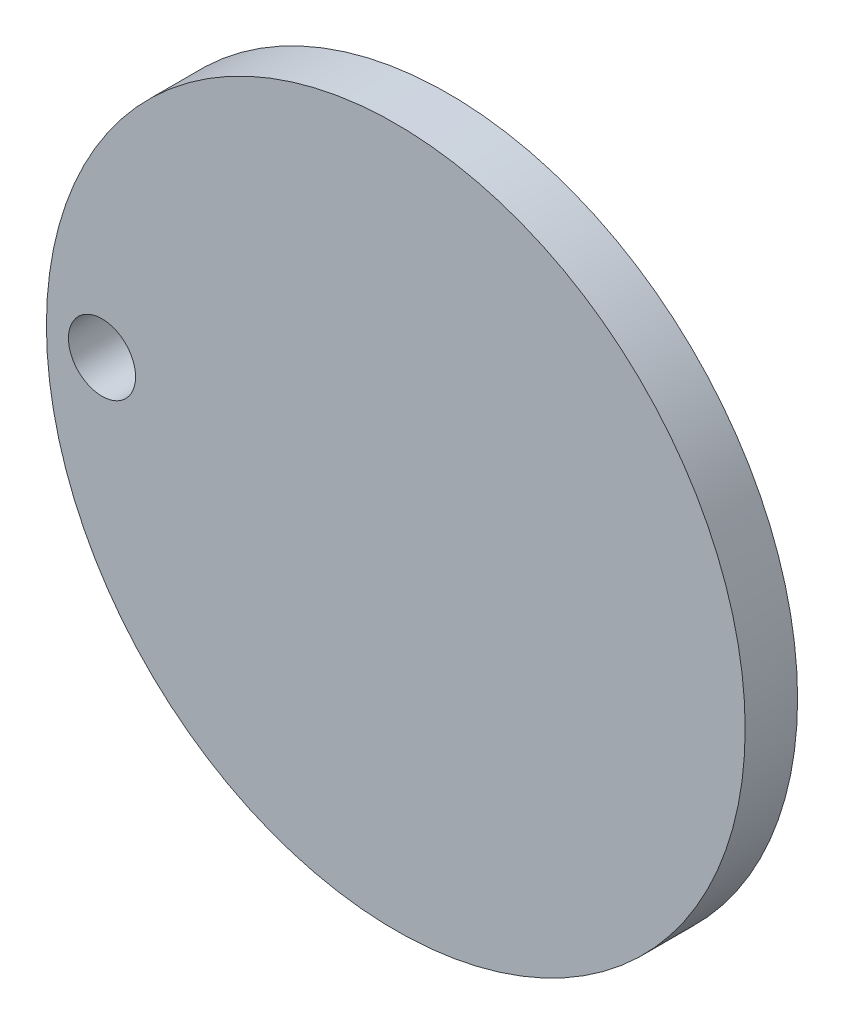
ISO-10303-21;
HEADER;
FILE_DESCRIPTION(('STEP AP214'),'2;1');
FILE_NAME('part.step','',(''),(''),'','','');
FILE_SCHEMA(('AUTOMOTIVE_DESIGN { 1 0 10303 214 1 1 1 1 }'));
ENDSEC;
DATA;
#1=APPLICATION_CONTEXT('core data for automotive mechanical design processes');
#2=APPLICATION_PROTOCOL_DEFINITION('international standard','automotive_design',2000,#1);
#3=PRODUCT_CONTEXT('',#1,'mechanical');
#4=PRODUCT('Part','Part','',(#3));
#5=PRODUCT_RELATED_PRODUCT_CATEGORY('part','',(#4));
#6=PRODUCT_DEFINITION_FORMATION('','',#4);
#7=PRODUCT_DEFINITION_CONTEXT('part definition',#1,'design');
#8=PRODUCT_DEFINITION('design','',#6,#7);
#9=PRODUCT_DEFINITION_SHAPE('','',#8);
#10=(LENGTH_UNIT() NAMED_UNIT(*) SI_UNIT(.MILLI.,.METRE.));
#11=(NAMED_UNIT(*) PLANE_ANGLE_UNIT() SI_UNIT($,.RADIAN.));
#12=(NAMED_UNIT(*) SI_UNIT($,.STERADIAN.) SOLID_ANGLE_UNIT());
#13=UNCERTAINTY_MEASURE_WITH_UNIT(LENGTH_MEASURE(1.E-05),#10,'distance_accuracy_value','');
#14=(GEOMETRIC_REPRESENTATION_CONTEXT(3) GLOBAL_UNCERTAINTY_ASSIGNED_CONTEXT((#13)) GLOBAL_UNIT_ASSIGNED_CONTEXT((#10,
#11,#12)) REPRESENTATION_CONTEXT('',''));
#15=CARTESIAN_POINT('',(0.,0.,0.));
#16=DIRECTION('',(0.,0.,1.));
#17=DIRECTION('',(1.,0.,0.));
#18=AXIS2_PLACEMENT_3D('',#15,#16,#17);
#19=CARTESIAN_POINT('',(0.,0.,3.));
#20=DIRECTION('',(0.,0.,1.));
#21=DIRECTION('',(1.,0.,0.));
#22=AXIS2_PLACEMENT_3D('',#19,#20,#21);
#23=PLANE('',#22);
#24=CARTESIAN_POINT('',(0.,0.,3.));
#25=DIRECTION('',(0.,0.,1.));
#26=DIRECTION('',(1.,0.,0.));
#27=AXIS2_PLACEMENT_3D('',#24,#25,#26);
#28=CIRCLE('',#27,20.);
#29=CARTESIAN_POINT('',(20.,0.,3.));
#30=VERTEX_POINT('',#29);
#31=EDGE_CURVE('E10',#30,#30,#28,.T.);
#32=ORIENTED_EDGE('',*,*,#31,.T.);
#33=EDGE_LOOP('',(#32));
#34=FACE_BOUND('',#33,.T.);
#35=CARTESIAN_POINT('',(-16.8169959576064,0.,3.));
#36=DIRECTION('',(0.,0.,1.));
#37=DIRECTION('',(1.,0.,0.));
#38=AXIS2_PLACEMENT_3D('',#35,#36,#37);
#39=CIRCLE('',#38,1.92120010790623);
#40=CARTESIAN_POINT('',(-14.8957958497002,0.,3.));
#41=VERTEX_POINT('',#40);
#42=EDGE_CURVE('E42',#41,#41,#39,.T.);
#43=ORIENTED_EDGE('',*,*,#42,.F.);
#44=EDGE_LOOP('',(#43));
#45=FACE_BOUND('',#44,.T.);
#46=ADVANCED_FACE('F31',(#34,#45),#23,.T.);
#47=CARTESIAN_POINT('',(0.,0.,0.));
#48=DIRECTION('',(0.,0.,1.));
#49=DIRECTION('',(1.,0.,0.));
#50=AXIS2_PLACEMENT_3D('',#47,#48,#49);
#51=PLANE('',#50);
#52=CARTESIAN_POINT('',(0.,0.,0.));
#53=DIRECTION('',(0.,0.,1.));
#54=DIRECTION('',(1.,0.,0.));
#55=AXIS2_PLACEMENT_3D('',#52,#53,#54);
#56=CIRCLE('',#55,20.);
#57=CARTESIAN_POINT('',(20.,0.,0.));
#58=VERTEX_POINT('',#57);
#59=EDGE_CURVE('E35',#58,#58,#56,.T.);
#60=ORIENTED_EDGE('',*,*,#59,.F.);
#61=EDGE_LOOP('',(#60));
#62=FACE_BOUND('',#61,.T.);
#63=CARTESIAN_POINT('',(-16.8169959576064,0.,0.));
#64=DIRECTION('',(0.,0.,1.));
#65=DIRECTION('',(1.,0.,0.));
#66=AXIS2_PLACEMENT_3D('',#63,#64,#65);
#67=CIRCLE('',#66,1.92120010790623);
#68=CARTESIAN_POINT('',(-14.8957958497002,0.,0.));
#69=VERTEX_POINT('',#68);
#70=EDGE_CURVE('E44',#69,#69,#67,.T.);
#71=ORIENTED_EDGE('',*,*,#70,.T.);
#72=EDGE_LOOP('',(#71));
#73=FACE_BOUND('',#72,.T.);
#74=ADVANCED_FACE('F54',(#62,#73),#51,.F.);
#75=CARTESIAN_POINT('',(0.,0.,3.));
#76=DIRECTION('',(0.,0.,-1.));
#77=DIRECTION('',(-1.,0.,0.));
#78=AXIS2_PLACEMENT_3D('',#75,#76,#77);
#79=CYLINDRICAL_SURFACE('',#78,20.);
#80=ORIENTED_EDGE('',*,*,#31,.F.);
#81=EDGE_LOOP('',(#80));
#82=FACE_BOUND('',#81,.T.);
#83=ORIENTED_EDGE('',*,*,#59,.T.);
#84=EDGE_LOOP('',(#83));
#85=FACE_BOUND('',#84,.T.);
#86=ADVANCED_FACE('F33',(#82,#85),#79,.T.);
#87=CARTESIAN_POINT('',(-16.8169959576064,0.,3.));
#88=DIRECTION('',(0.,0.,-1.));
#89=DIRECTION('',(-1.,0.,0.));
#90=AXIS2_PLACEMENT_3D('',#87,#88,#89);
#91=CYLINDRICAL_SURFACE('',#90,1.92120010790623);
#92=ORIENTED_EDGE('',*,*,#42,.T.);
#93=EDGE_LOOP('',(#92));
#94=FACE_BOUND('',#93,.T.);
#95=ORIENTED_EDGE('',*,*,#70,.F.);
#96=EDGE_LOOP('',(#95));
#97=FACE_BOUND('',#96,.T.);
#98=ADVANCED_FACE('F50',(#94,#97),#91,.F.);
#99=CLOSED_SHELL('',(#46,#74,#86,#98));
#100=MANIFOLD_SOLID_BREP('B2',#99);
#101=ADVANCED_BREP_SHAPE_REPRESENTATION('',(#18,#100),#14);
#102=SHAPE_DEFINITION_REPRESENTATION(#9,#101);
ENDSEC;
END-ISO-10303-21;
